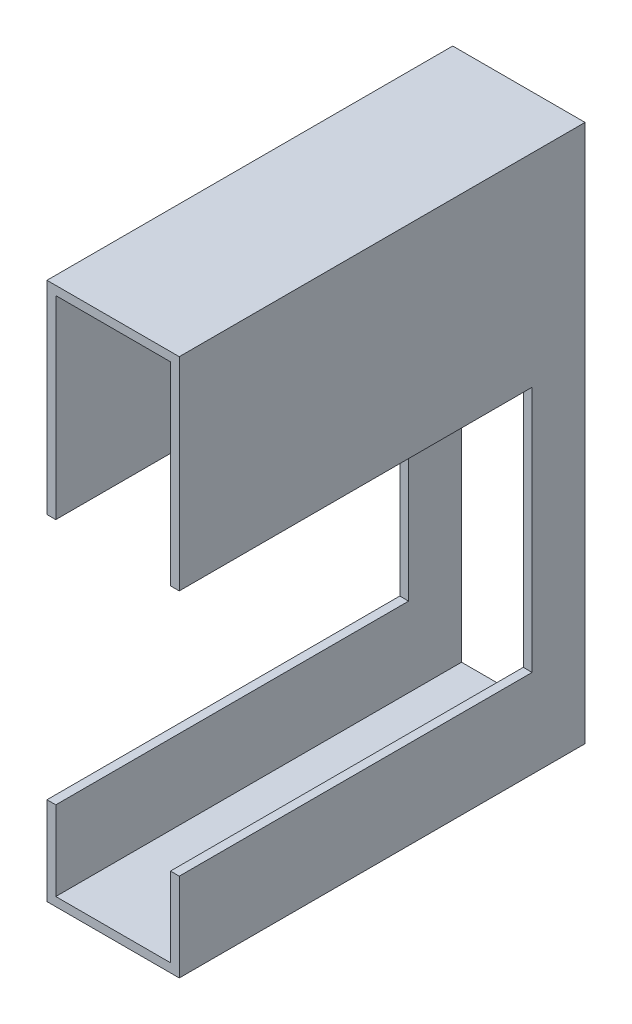
ISO-10303-21;
HEADER;
FILE_DESCRIPTION(('STEP AP214'),'2;1');
FILE_NAME('part.step','',(''),(''),'','','');
FILE_SCHEMA(('AUTOMOTIVE_DESIGN { 1 0 10303 214 1 1 1 1 }'));
ENDSEC;
DATA;
#1=APPLICATION_CONTEXT('core data for automotive mechanical design processes');
#2=APPLICATION_PROTOCOL_DEFINITION('international standard','automotive_design',2000,#1);
#3=PRODUCT_CONTEXT('',#1,'mechanical');
#4=PRODUCT('Part','Part','',(#3));
#5=PRODUCT_RELATED_PRODUCT_CATEGORY('part','',(#4));
#6=PRODUCT_DEFINITION_FORMATION('','',#4);
#7=PRODUCT_DEFINITION_CONTEXT('part definition',#1,'design');
#8=PRODUCT_DEFINITION('design','',#6,#7);
#9=PRODUCT_DEFINITION_SHAPE('','',#8);
#10=(LENGTH_UNIT() NAMED_UNIT(*) SI_UNIT(.MILLI.,.METRE.));
#11=(NAMED_UNIT(*) PLANE_ANGLE_UNIT() SI_UNIT($,.RADIAN.));
#12=(NAMED_UNIT(*) SI_UNIT($,.STERADIAN.) SOLID_ANGLE_UNIT());
#13=UNCERTAINTY_MEASURE_WITH_UNIT(LENGTH_MEASURE(1.E-05),#10,'distance_accuracy_value','');
#14=(GEOMETRIC_REPRESENTATION_CONTEXT(3) GLOBAL_UNCERTAINTY_ASSIGNED_CONTEXT((#13)) GLOBAL_UNIT_ASSIGNED_CONTEXT((#10,
#11,#12)) REPRESENTATION_CONTEXT('',''));
#15=CARTESIAN_POINT('',(0.,0.,0.));
#16=DIRECTION('',(0.,0.,1.));
#17=DIRECTION('',(1.,0.,0.));
#18=AXIS2_PLACEMENT_3D('',#15,#16,#17);
#19=CARTESIAN_POINT('',(0.,0.,230.));
#20=DIRECTION('',(0.,0.,1.));
#21=DIRECTION('',(1.,0.,0.));
#22=AXIS2_PLACEMENT_3D('',#19,#20,#21);
#23=PLANE('',#22);
#24=DIRECTION('',(1.,0.,0.));
#25=VECTOR('',#24,1.);
#26=CARTESIAN_POINT('',(-37.5,37.5000000000001,230.));
#27=LINE('',#26,#25);
#28=CARTESIAN_POINT('',(32.5,37.5000000000002,230.));
#29=VERTEX_POINT('',#28);
#30=CARTESIAN_POINT('',(37.5,37.5000000000002,230.));
#31=VERTEX_POINT('',#30);
#32=EDGE_CURVE('E244',#29,#31,#27,.T.);
#33=ORIENTED_EDGE('',*,*,#32,.T.);
#34=DIRECTION('',(0.,1.,0.));
#35=VECTOR('',#34,1.);
#36=CARTESIAN_POINT('',(37.5,152.5,230.));
#37=LINE('',#36,#35);
#38=CARTESIAN_POINT('',(37.5,152.5,230.));
#39=VERTEX_POINT('',#38);
#40=EDGE_CURVE('E197',#31,#39,#37,.T.);
#41=ORIENTED_EDGE('',*,*,#40,.T.);
#42=DIRECTION('',(-1.,0.,0.));
#43=VECTOR('',#42,1.);
#44=CARTESIAN_POINT('',(-37.5,152.5,230.));
#45=LINE('',#44,#43);
#46=CARTESIAN_POINT('',(-37.5,152.5,230.));
#47=VERTEX_POINT('',#46);
#48=EDGE_CURVE('E202',#39,#47,#45,.T.);
#49=ORIENTED_EDGE('',*,*,#48,.T.);
#50=DIRECTION('',(0.,-1.,0.));
#51=VECTOR('',#50,1.);
#52=CARTESIAN_POINT('',(-37.5,152.5,230.));
#53=LINE('',#52,#51);
#54=CARTESIAN_POINT('',(-37.5,37.5000000000001,230.));
#55=VERTEX_POINT('',#54);
#56=EDGE_CURVE('E182',#47,#55,#53,.T.);
#57=ORIENTED_EDGE('',*,*,#56,.T.);
#58=CARTESIAN_POINT('',(-32.5,37.5000000000001,230.));
#59=VERTEX_POINT('',#58);
#60=EDGE_CURVE('E322',#55,#59,#27,.T.);
#61=ORIENTED_EDGE('',*,*,#60,.T.);
#62=DIRECTION('',(0.,-1.,0.));
#63=VECTOR('',#62,1.);
#64=CARTESIAN_POINT('',(-32.5,147.5,230.));
#65=LINE('',#64,#63);
#66=CARTESIAN_POINT('',(-32.5,147.5,230.));
#67=VERTEX_POINT('',#66);
#68=EDGE_CURVE('E251',#67,#59,#65,.T.);
#69=ORIENTED_EDGE('',*,*,#68,.F.);
#70=DIRECTION('',(-1.,0.,0.));
#71=VECTOR('',#70,1.);
#72=CARTESIAN_POINT('',(-32.5,147.5,230.));
#73=LINE('',#72,#71);
#74=CARTESIAN_POINT('',(32.5,147.5,230.));
#75=VERTEX_POINT('',#74);
#76=EDGE_CURVE('E263',#75,#67,#73,.T.);
#77=ORIENTED_EDGE('',*,*,#76,.F.);
#78=DIRECTION('',(0.,1.,0.));
#79=VECTOR('',#78,1.);
#80=CARTESIAN_POINT('',(32.5,147.5,230.));
#81=LINE('',#80,#79);
#82=EDGE_CURVE('E284',#29,#75,#81,.T.);
#83=ORIENTED_EDGE('',*,*,#82,.F.);
#84=EDGE_LOOP('',(#33,#41,#49,#57,#61,#69,#77,#83));
#85=FACE_BOUND('',#84,.T.);
#86=ADVANCED_FACE('F44',(#85),#23,.T.);
#87=DIRECTION('',(1.,0.,0.));
#88=VECTOR('',#87,1.);
#89=CARTESIAN_POINT('',(-37.5,-102.5,230.));
#90=LINE('',#89,#88);
#91=CARTESIAN_POINT('',(-37.5,-102.5,230.));
#92=VERTEX_POINT('',#91);
#93=CARTESIAN_POINT('',(-32.5,-102.5,230.));
#94=VERTEX_POINT('',#93);
#95=EDGE_CURVE('E68',#92,#94,#90,.T.);
#96=ORIENTED_EDGE('',*,*,#95,.F.);
#97=CARTESIAN_POINT('',(-37.5,-152.5,230.));
#98=VERTEX_POINT('',#97);
#99=EDGE_CURVE('E170',#92,#98,#53,.T.);
#100=ORIENTED_EDGE('',*,*,#99,.T.);
#101=DIRECTION('',(1.,0.,0.));
#102=VECTOR('',#101,1.);
#103=CARTESIAN_POINT('',(-37.5,-152.5,230.));
#104=LINE('',#103,#102);
#105=CARTESIAN_POINT('',(37.5,-152.5,230.));
#106=VERTEX_POINT('',#105);
#107=EDGE_CURVE('E188',#98,#106,#104,.T.);
#108=ORIENTED_EDGE('',*,*,#107,.T.);
#109=CARTESIAN_POINT('',(37.5,-102.5,230.));
#110=VERTEX_POINT('',#109);
#111=EDGE_CURVE('E198',#106,#110,#37,.T.);
#112=ORIENTED_EDGE('',*,*,#111,.T.);
#113=CARTESIAN_POINT('',(32.5,-102.5,230.));
#114=VERTEX_POINT('',#113);
#115=EDGE_CURVE('E175',#114,#110,#90,.T.);
#116=ORIENTED_EDGE('',*,*,#115,.F.);
#117=CARTESIAN_POINT('',(32.5,-147.5,230.));
#118=VERTEX_POINT('',#117);
#119=EDGE_CURVE('E309',#118,#114,#81,.T.);
#120=ORIENTED_EDGE('',*,*,#119,.F.);
#121=DIRECTION('',(1.,0.,0.));
#122=VECTOR('',#121,1.);
#123=CARTESIAN_POINT('',(-32.5,-147.5,230.));
#124=LINE('',#123,#122);
#125=CARTESIAN_POINT('',(-32.5,-147.5,230.));
#126=VERTEX_POINT('',#125);
#127=EDGE_CURVE('E257',#126,#118,#124,.T.);
#128=ORIENTED_EDGE('',*,*,#127,.F.);
#129=EDGE_CURVE('E173',#94,#126,#65,.T.);
#130=ORIENTED_EDGE('',*,*,#129,.F.);
#131=EDGE_LOOP('',(#96,#100,#108,#112,#116,#120,#128,#130));
#132=FACE_BOUND('',#131,.T.);
#133=ADVANCED_FACE('F169',(#132),#23,.T.);
#134=CARTESIAN_POINT('',(0.,0.,0.));
#135=DIRECTION('',(0.,0.,1.));
#136=DIRECTION('',(1.,0.,0.));
#137=AXIS2_PLACEMENT_3D('',#134,#135,#136);
#138=PLANE('',#137);
#139=DIRECTION('',(0.,-1.,0.));
#140=VECTOR('',#139,1.);
#141=CARTESIAN_POINT('',(-37.5,152.5,0.));
#142=LINE('',#141,#140);
#143=CARTESIAN_POINT('',(-37.5,152.5,0.));
#144=VERTEX_POINT('',#143);
#145=CARTESIAN_POINT('',(-37.5,-152.5,0.));
#146=VERTEX_POINT('',#145);
#147=EDGE_CURVE('E206',#144,#146,#142,.T.);
#148=ORIENTED_EDGE('',*,*,#147,.F.);
#149=DIRECTION('',(-1.,0.,0.));
#150=VECTOR('',#149,1.);
#151=CARTESIAN_POINT('',(-37.5,152.5,0.));
#152=LINE('',#151,#150);
#153=CARTESIAN_POINT('',(37.5,152.5,0.));
#154=VERTEX_POINT('',#153);
#155=EDGE_CURVE('E183',#154,#144,#152,.T.);
#156=ORIENTED_EDGE('',*,*,#155,.F.);
#157=DIRECTION('',(0.,1.,0.));
#158=VECTOR('',#157,1.);
#159=CARTESIAN_POINT('',(37.5,152.5,0.));
#160=LINE('',#159,#158);
#161=CARTESIAN_POINT('',(37.5,-152.5,0.));
#162=VERTEX_POINT('',#161);
#163=EDGE_CURVE('E189',#162,#154,#160,.T.);
#164=ORIENTED_EDGE('',*,*,#163,.F.);
#165=DIRECTION('',(1.,0.,0.));
#166=VECTOR('',#165,1.);
#167=CARTESIAN_POINT('',(-37.5,-152.5,0.));
#168=LINE('',#167,#166);
#169=EDGE_CURVE('E209',#146,#162,#168,.T.);
#170=ORIENTED_EDGE('',*,*,#169,.F.);
#171=EDGE_LOOP('',(#148,#156,#164,#170));
#172=FACE_BOUND('',#171,.T.);
#173=DIRECTION('',(0.,1.,0.));
#174=VECTOR('',#173,1.);
#175=CARTESIAN_POINT('',(32.5,147.5,0.));
#176=LINE('',#175,#174);
#177=CARTESIAN_POINT('',(32.5,-147.5,0.));
#178=VERTEX_POINT('',#177);
#179=CARTESIAN_POINT('',(32.5,147.5,0.));
#180=VERTEX_POINT('',#179);
#181=EDGE_CURVE('E267',#178,#180,#176,.T.);
#182=ORIENTED_EDGE('',*,*,#181,.T.);
#183=DIRECTION('',(-1.,0.,0.));
#184=VECTOR('',#183,1.);
#185=CARTESIAN_POINT('',(-32.5,147.5,0.));
#186=LINE('',#185,#184);
#187=CARTESIAN_POINT('',(-32.5,147.5,0.));
#188=VERTEX_POINT('',#187);
#189=EDGE_CURVE('E271',#180,#188,#186,.T.);
#190=ORIENTED_EDGE('',*,*,#189,.T.);
#191=DIRECTION('',(0.,-1.,0.));
#192=VECTOR('',#191,1.);
#193=CARTESIAN_POINT('',(-32.5,147.5,0.));
#194=LINE('',#193,#192);
#195=CARTESIAN_POINT('',(-32.5,-147.5,0.));
#196=VERTEX_POINT('',#195);
#197=EDGE_CURVE('E276',#188,#196,#194,.T.);
#198=ORIENTED_EDGE('',*,*,#197,.T.);
#199=DIRECTION('',(1.,0.,0.));
#200=VECTOR('',#199,1.);
#201=CARTESIAN_POINT('',(-32.5,-147.5,0.));
#202=LINE('',#201,#200);
#203=EDGE_CURVE('E280',#196,#178,#202,.T.);
#204=ORIENTED_EDGE('',*,*,#203,.T.);
#205=EDGE_LOOP('',(#182,#190,#198,#204));
#206=FACE_BOUND('',#205,.T.);
#207=ADVANCED_FACE('F301',(#172,#206),#138,.F.);
#208=CARTESIAN_POINT('',(-37.5,152.5,230.));
#209=DIRECTION('',(1.,0.,0.));
#210=DIRECTION('',(0.,1.,0.));
#211=AXIS2_PLACEMENT_3D('',#208,#209,#210);
#212=PLANE('',#211);
#213=DIRECTION('',(0.,1.,0.));
#214=VECTOR('',#213,1.);
#215=CARTESIAN_POINT('',(-37.5,37.5000000000002,30.));
#216=LINE('',#215,#214);
#217=CARTESIAN_POINT('',(-37.5,-102.5,30.));
#218=VERTEX_POINT('',#217);
#219=CARTESIAN_POINT('',(-37.5,37.5000000000002,30.));
#220=VERTEX_POINT('',#219);
#221=EDGE_CURVE('E164',#218,#220,#216,.T.);
#222=ORIENTED_EDGE('',*,*,#221,.T.);
#223=DIRECTION('',(0.,0.,1.));
#224=VECTOR('',#223,1.);
#225=CARTESIAN_POINT('',(-37.5,37.5000000000002,30.));
#226=LINE('',#225,#224);
#227=EDGE_CURVE('E242',#220,#55,#226,.T.);
#228=ORIENTED_EDGE('',*,*,#227,.T.);
#229=ORIENTED_EDGE('',*,*,#56,.F.);
#230=DIRECTION('',(0.,0.,-1.));
#231=VECTOR('',#230,1.);
#232=CARTESIAN_POINT('',(-37.5,152.5,230.));
#233=LINE('',#232,#231);
#234=EDGE_CURVE('E205',#47,#144,#233,.T.);
#235=ORIENTED_EDGE('',*,*,#234,.T.);
#236=ORIENTED_EDGE('',*,*,#147,.T.);
#237=DIRECTION('',(0.,0.,-1.));
#238=VECTOR('',#237,1.);
#239=CARTESIAN_POINT('',(-37.5,-152.5,230.));
#240=LINE('',#239,#238);
#241=EDGE_CURVE('E180',#98,#146,#240,.T.);
#242=ORIENTED_EDGE('',*,*,#241,.F.);
#243=ORIENTED_EDGE('',*,*,#99,.F.);
#244=DIRECTION('',(0.,0.,-1.));
#245=VECTOR('',#244,1.);
#246=CARTESIAN_POINT('',(-37.5,-102.5,30.));
#247=LINE('',#246,#245);
#248=EDGE_CURVE('E155',#92,#218,#247,.T.);
#249=ORIENTED_EDGE('',*,*,#248,.T.);
#250=EDGE_LOOP('',(#222,#228,#229,#235,#236,#242,#243,#249));
#251=FACE_BOUND('',#250,.T.);
#252=ADVANCED_FACE('F46',(#251),#212,.F.);
#253=CARTESIAN_POINT('',(-37.5,-152.5,230.));
#254=DIRECTION('',(0.,1.,0.));
#255=DIRECTION('',(0.,0.,1.));
#256=AXIS2_PLACEMENT_3D('',#253,#254,#255);
#257=PLANE('',#256);
#258=ORIENTED_EDGE('',*,*,#169,.T.);
#259=DIRECTION('',(0.,0.,-1.));
#260=VECTOR('',#259,1.);
#261=CARTESIAN_POINT('',(37.5,-152.5,230.));
#262=LINE('',#261,#260);
#263=EDGE_CURVE('E221',#106,#162,#262,.T.);
#264=ORIENTED_EDGE('',*,*,#263,.F.);
#265=ORIENTED_EDGE('',*,*,#107,.F.);
#266=ORIENTED_EDGE('',*,*,#241,.T.);
#267=EDGE_LOOP('',(#258,#264,#265,#266));
#268=FACE_BOUND('',#267,.T.);
#269=ADVANCED_FACE('F354',(#268),#257,.F.);
#270=CARTESIAN_POINT('',(37.5,152.5,230.));
#271=DIRECTION('',(-1.,0.,0.));
#272=DIRECTION('',(0.,-1.,0.));
#273=AXIS2_PLACEMENT_3D('',#270,#271,#272);
#274=PLANE('',#273);
#275=ORIENTED_EDGE('',*,*,#40,.F.);
#276=DIRECTION('',(0.,0.,1.));
#277=VECTOR('',#276,1.);
#278=CARTESIAN_POINT('',(37.5,37.5000000000002,30.));
#279=LINE('',#278,#277);
#280=CARTESIAN_POINT('',(37.5,37.5000000000002,30.));
#281=VERTEX_POINT('',#280);
#282=EDGE_CURVE('E165',#281,#31,#279,.T.);
#283=ORIENTED_EDGE('',*,*,#282,.F.);
#284=DIRECTION('',(0.,1.,0.));
#285=VECTOR('',#284,1.);
#286=CARTESIAN_POINT('',(37.5,37.5000000000002,30.));
#287=LINE('',#286,#285);
#288=CARTESIAN_POINT('',(37.5,-102.5,30.));
#289=VERTEX_POINT('',#288);
#290=EDGE_CURVE('E330',#289,#281,#287,.T.);
#291=ORIENTED_EDGE('',*,*,#290,.F.);
#292=DIRECTION('',(0.,0.,-1.));
#293=VECTOR('',#292,1.);
#294=CARTESIAN_POINT('',(37.5,-102.5,30.));
#295=LINE('',#294,#293);
#296=EDGE_CURVE('E334',#110,#289,#295,.T.);
#297=ORIENTED_EDGE('',*,*,#296,.F.);
#298=ORIENTED_EDGE('',*,*,#111,.F.);
#299=ORIENTED_EDGE('',*,*,#263,.T.);
#300=ORIENTED_EDGE('',*,*,#163,.T.);
#301=DIRECTION('',(0.,0.,-1.));
#302=VECTOR('',#301,1.);
#303=CARTESIAN_POINT('',(37.5,152.5,230.));
#304=LINE('',#303,#302);
#305=EDGE_CURVE('E217',#39,#154,#304,.T.);
#306=ORIENTED_EDGE('',*,*,#305,.F.);
#307=EDGE_LOOP('',(#275,#283,#291,#297,#298,#299,#300,#306));
#308=FACE_BOUND('',#307,.T.);
#309=ADVANCED_FACE('F358',(#308),#274,.F.);
#310=CARTESIAN_POINT('',(-37.5,152.5,230.));
#311=DIRECTION('',(0.,-1.,0.));
#312=DIRECTION('',(0.,0.,-1.));
#313=AXIS2_PLACEMENT_3D('',#310,#311,#312);
#314=PLANE('',#313);
#315=ORIENTED_EDGE('',*,*,#155,.T.);
#316=ORIENTED_EDGE('',*,*,#234,.F.);
#317=ORIENTED_EDGE('',*,*,#48,.F.);
#318=ORIENTED_EDGE('',*,*,#305,.T.);
#319=EDGE_LOOP('',(#315,#316,#317,#318));
#320=FACE_BOUND('',#319,.T.);
#321=ADVANCED_FACE('F347',(#320),#314,.F.);
#322=CARTESIAN_POINT('',(32.5,147.5,230.));
#323=DIRECTION('',(-1.,0.,0.));
#324=DIRECTION('',(0.,-1.,0.));
#325=AXIS2_PLACEMENT_3D('',#322,#323,#324);
#326=PLANE('',#325);
#327=DIRECTION('',(0.,0.,-1.));
#328=VECTOR('',#327,1.);
#329=CARTESIAN_POINT('',(32.5,37.5000000000002,230.));
#330=LINE('',#329,#328);
#331=CARTESIAN_POINT('',(32.5,37.5000000000002,30.));
#332=VERTEX_POINT('',#331);
#333=EDGE_CURVE('E272',#29,#332,#330,.T.);
#334=ORIENTED_EDGE('',*,*,#333,.F.);
#335=ORIENTED_EDGE('',*,*,#82,.T.);
#336=DIRECTION('',(0.,0.,-1.));
#337=VECTOR('',#336,1.);
#338=CARTESIAN_POINT('',(32.5,147.5,230.));
#339=LINE('',#338,#337);
#340=EDGE_CURVE('E193',#75,#180,#339,.T.);
#341=ORIENTED_EDGE('',*,*,#340,.T.);
#342=ORIENTED_EDGE('',*,*,#181,.F.);
#343=DIRECTION('',(0.,0.,-1.));
#344=VECTOR('',#343,1.);
#345=CARTESIAN_POINT('',(32.5,-147.5,230.));
#346=LINE('',#345,#344);
#347=EDGE_CURVE('E261',#118,#178,#346,.T.);
#348=ORIENTED_EDGE('',*,*,#347,.F.);
#349=ORIENTED_EDGE('',*,*,#119,.T.);
#350=DIRECTION('',(0.,0.,1.));
#351=VECTOR('',#350,1.);
#352=CARTESIAN_POINT('',(32.5,-102.5,230.));
#353=LINE('',#352,#351);
#354=CARTESIAN_POINT('',(32.5,-102.5,30.));
#355=VERTEX_POINT('',#354);
#356=EDGE_CURVE('E320',#355,#114,#353,.T.);
#357=ORIENTED_EDGE('',*,*,#356,.F.);
#358=DIRECTION('',(0.,-1.,0.));
#359=VECTOR('',#358,1.);
#360=CARTESIAN_POINT('',(32.5,147.5,30.));
#361=LINE('',#360,#359);
#362=EDGE_CURVE('E317',#332,#355,#361,.T.);
#363=ORIENTED_EDGE('',*,*,#362,.F.);
#364=EDGE_LOOP('',(#334,#335,#341,#342,#348,#349,#357,#363));
#365=FACE_BOUND('',#364,.T.);
#366=ADVANCED_FACE('F297',(#365),#326,.T.);
#367=CARTESIAN_POINT('',(-32.5,147.5,230.));
#368=DIRECTION('',(0.,-1.,0.));
#369=DIRECTION('',(0.,0.,-1.));
#370=AXIS2_PLACEMENT_3D('',#367,#368,#369);
#371=PLANE('',#370);
#372=ORIENTED_EDGE('',*,*,#189,.F.);
#373=ORIENTED_EDGE('',*,*,#340,.F.);
#374=ORIENTED_EDGE('',*,*,#76,.T.);
#375=DIRECTION('',(0.,0.,-1.));
#376=VECTOR('',#375,1.);
#377=CARTESIAN_POINT('',(-32.5,147.5,230.));
#378=LINE('',#377,#376);
#379=EDGE_CURVE('E253',#67,#188,#378,.T.);
#380=ORIENTED_EDGE('',*,*,#379,.T.);
#381=EDGE_LOOP('',(#372,#373,#374,#380));
#382=FACE_BOUND('',#381,.T.);
#383=ADVANCED_FACE('F418',(#382),#371,.T.);
#384=CARTESIAN_POINT('',(-32.5,147.5,230.));
#385=DIRECTION('',(1.,0.,0.));
#386=DIRECTION('',(0.,1.,0.));
#387=AXIS2_PLACEMENT_3D('',#384,#385,#386);
#388=PLANE('',#387);
#389=DIRECTION('',(0.,0.,1.));
#390=VECTOR('',#389,1.);
#391=CARTESIAN_POINT('',(-32.5,37.5000000000001,230.));
#392=LINE('',#391,#390);
#393=CARTESIAN_POINT('',(-32.5,37.5000000000002,30.));
#394=VERTEX_POINT('',#393);
#395=EDGE_CURVE('E11',#394,#59,#392,.T.);
#396=ORIENTED_EDGE('',*,*,#395,.F.);
#397=DIRECTION('',(0.,1.,0.));
#398=VECTOR('',#397,1.);
#399=CARTESIAN_POINT('',(-32.5,147.5,30.));
#400=LINE('',#399,#398);
#401=CARTESIAN_POINT('',(-32.5,-102.5,30.));
#402=VERTEX_POINT('',#401);
#403=EDGE_CURVE('E53',#402,#394,#400,.T.);
#404=ORIENTED_EDGE('',*,*,#403,.F.);
#405=DIRECTION('',(0.,0.,-1.));
#406=VECTOR('',#405,1.);
#407=CARTESIAN_POINT('',(-32.5,-102.5,230.));
#408=LINE('',#407,#406);
#409=EDGE_CURVE('E227',#94,#402,#408,.T.);
#410=ORIENTED_EDGE('',*,*,#409,.F.);
#411=ORIENTED_EDGE('',*,*,#129,.T.);
#412=DIRECTION('',(0.,0.,-1.));
#413=VECTOR('',#412,1.);
#414=CARTESIAN_POINT('',(-32.5,-147.5,230.));
#415=LINE('',#414,#413);
#416=EDGE_CURVE('E288',#126,#196,#415,.T.);
#417=ORIENTED_EDGE('',*,*,#416,.T.);
#418=ORIENTED_EDGE('',*,*,#197,.F.);
#419=ORIENTED_EDGE('',*,*,#379,.F.);
#420=ORIENTED_EDGE('',*,*,#68,.T.);
#421=EDGE_LOOP('',(#396,#404,#410,#411,#417,#418,#419,#420));
#422=FACE_BOUND('',#421,.T.);
#423=ADVANCED_FACE('F248',(#422),#388,.T.);
#424=CARTESIAN_POINT('',(-32.5,-147.5,230.));
#425=DIRECTION('',(0.,1.,0.));
#426=DIRECTION('',(0.,0.,1.));
#427=AXIS2_PLACEMENT_3D('',#424,#425,#426);
#428=PLANE('',#427);
#429=ORIENTED_EDGE('',*,*,#203,.F.);
#430=ORIENTED_EDGE('',*,*,#416,.F.);
#431=ORIENTED_EDGE('',*,*,#127,.T.);
#432=ORIENTED_EDGE('',*,*,#347,.T.);
#433=EDGE_LOOP('',(#429,#430,#431,#432));
#434=FACE_BOUND('',#433,.T.);
#435=ADVANCED_FACE('F305',(#434),#428,.T.);
#436=CARTESIAN_POINT('',(-37.5,-102.5,30.));
#437=DIRECTION('',(0.,-1.,0.));
#438=DIRECTION('',(1.,0.,0.));
#439=AXIS2_PLACEMENT_3D('',#436,#437,#438);
#440=PLANE('',#439);
#441=ORIENTED_EDGE('',*,*,#409,.T.);
#442=DIRECTION('',(1.,0.,0.));
#443=VECTOR('',#442,1.);
#444=CARTESIAN_POINT('',(-37.5,-102.5,30.));
#445=LINE('',#444,#443);
#446=EDGE_CURVE('E158',#218,#402,#445,.T.);
#447=ORIENTED_EDGE('',*,*,#446,.F.);
#448=ORIENTED_EDGE('',*,*,#248,.F.);
#449=ORIENTED_EDGE('',*,*,#95,.T.);
#450=EDGE_LOOP('',(#441,#447,#448,#449));
#451=FACE_BOUND('',#450,.T.);
#452=ADVANCED_FACE('F156',(#451),#440,.F.);
#453=CARTESIAN_POINT('',(-37.5,37.5000000000002,30.));
#454=DIRECTION('',(0.,0.,-1.));
#455=DIRECTION('',(0.,1.,0.));
#456=AXIS2_PLACEMENT_3D('',#453,#454,#455);
#457=PLANE('',#456);
#458=ORIENTED_EDGE('',*,*,#403,.T.);
#459=DIRECTION('',(1.,0.,0.));
#460=VECTOR('',#459,1.);
#461=CARTESIAN_POINT('',(-37.5,37.5000000000002,30.));
#462=LINE('',#461,#460);
#463=EDGE_CURVE('E234',#220,#394,#462,.T.);
#464=ORIENTED_EDGE('',*,*,#463,.F.);
#465=ORIENTED_EDGE('',*,*,#221,.F.);
#466=ORIENTED_EDGE('',*,*,#446,.T.);
#467=EDGE_LOOP('',(#458,#464,#465,#466));
#468=FACE_BOUND('',#467,.T.);
#469=ADVANCED_FACE('F233',(#468),#457,.F.);
#470=CARTESIAN_POINT('',(-37.5,37.5000000000002,30.));
#471=DIRECTION('',(0.,1.,0.));
#472=DIRECTION('',(-1.,0.,0.));
#473=AXIS2_PLACEMENT_3D('',#470,#471,#472);
#474=PLANE('',#473);
#475=ORIENTED_EDGE('',*,*,#395,.T.);
#476=ORIENTED_EDGE('',*,*,#60,.F.);
#477=ORIENTED_EDGE('',*,*,#227,.F.);
#478=ORIENTED_EDGE('',*,*,#463,.T.);
#479=EDGE_LOOP('',(#475,#476,#477,#478));
#480=FACE_BOUND('',#479,.T.);
#481=ADVANCED_FACE('F239',(#480),#474,.F.);
#482=ORIENTED_EDGE('',*,*,#333,.T.);
#483=EDGE_CURVE('E245',#332,#281,#462,.T.);
#484=ORIENTED_EDGE('',*,*,#483,.T.);
#485=ORIENTED_EDGE('',*,*,#282,.T.);
#486=ORIENTED_EDGE('',*,*,#32,.F.);
#487=EDGE_LOOP('',(#482,#484,#485,#486));
#488=FACE_BOUND('',#487,.T.);
#489=ADVANCED_FACE('F368',(#488),#474,.F.);
#490=ORIENTED_EDGE('',*,*,#362,.T.);
#491=EDGE_CURVE('E60',#355,#289,#445,.T.);
#492=ORIENTED_EDGE('',*,*,#491,.T.);
#493=ORIENTED_EDGE('',*,*,#290,.T.);
#494=ORIENTED_EDGE('',*,*,#483,.F.);
#495=EDGE_LOOP('',(#490,#492,#493,#494));
#496=FACE_BOUND('',#495,.T.);
#497=ADVANCED_FACE('F372',(#496),#457,.F.);
#498=ORIENTED_EDGE('',*,*,#356,.T.);
#499=ORIENTED_EDGE('',*,*,#115,.T.);
#500=ORIENTED_EDGE('',*,*,#296,.T.);
#501=ORIENTED_EDGE('',*,*,#491,.F.);
#502=EDGE_LOOP('',(#498,#499,#500,#501));
#503=FACE_BOUND('',#502,.T.);
#504=ADVANCED_FACE('F361',(#503),#440,.F.);
#505=CLOSED_SHELL('',(#86,#133,#207,#252,#269,#309,#321,#366,#383,#423,#435,#452,#469,#481,#489,
#497,#504));
#506=MANIFOLD_SOLID_BREP('B2',#505);
#507=ADVANCED_BREP_SHAPE_REPRESENTATION('',(#18,#506),#14);
#508=SHAPE_DEFINITION_REPRESENTATION(#9,#507);
ENDSEC;
END-ISO-10303-21;
